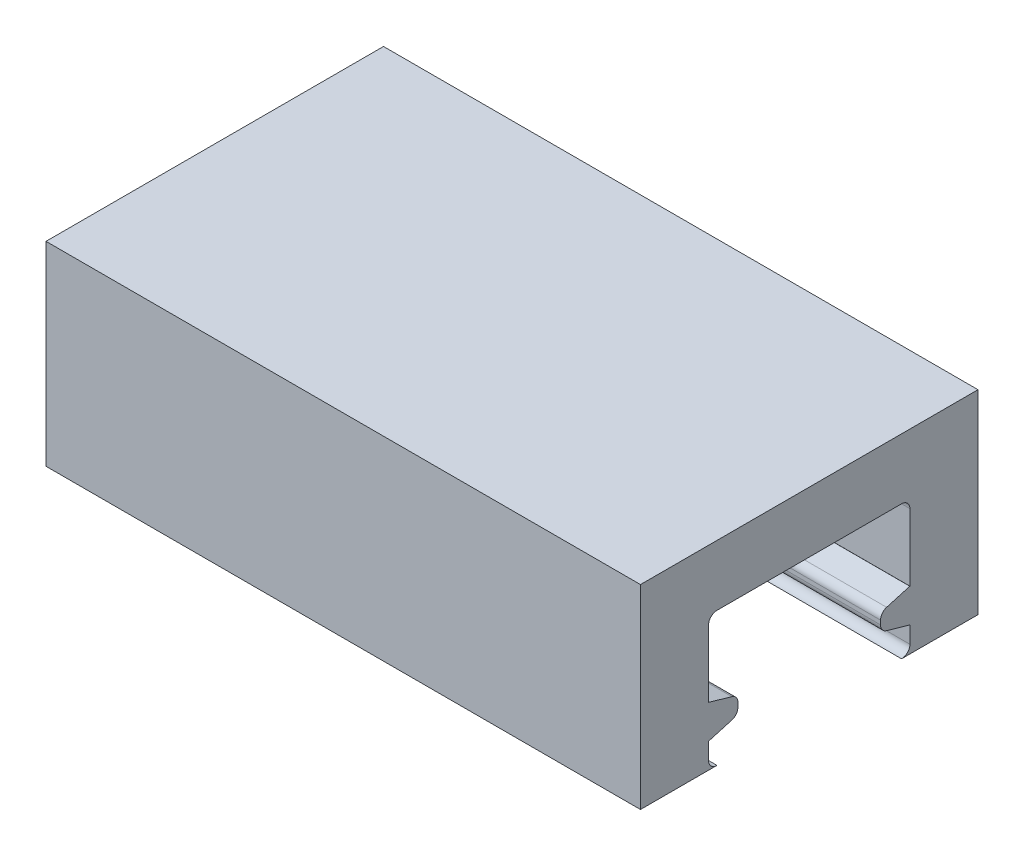
ISO-10303-21;
HEADER;
FILE_DESCRIPTION(('STEP AP214'),'2;1');
FILE_NAME('part.step','',(''),(''),'','','');
FILE_SCHEMA(('AUTOMOTIVE_DESIGN { 1 0 10303 214 1 1 1 1 }'));
ENDSEC;
DATA;
#1=APPLICATION_CONTEXT('core data for automotive mechanical design processes');
#2=APPLICATION_PROTOCOL_DEFINITION('international standard','automotive_design',2000,#1);
#3=PRODUCT_CONTEXT('',#1,'mechanical');
#4=PRODUCT('Part','Part','',(#3));
#5=PRODUCT_RELATED_PRODUCT_CATEGORY('part','',(#4));
#6=PRODUCT_DEFINITION_FORMATION('','',#4);
#7=PRODUCT_DEFINITION_CONTEXT('part definition',#1,'design');
#8=PRODUCT_DEFINITION('design','',#6,#7);
#9=PRODUCT_DEFINITION_SHAPE('','',#8);
#10=(LENGTH_UNIT() NAMED_UNIT(*) SI_UNIT(.MILLI.,.METRE.));
#11=(NAMED_UNIT(*) PLANE_ANGLE_UNIT() SI_UNIT($,.RADIAN.));
#12=(NAMED_UNIT(*) SI_UNIT($,.STERADIAN.) SOLID_ANGLE_UNIT());
#13=UNCERTAINTY_MEASURE_WITH_UNIT(LENGTH_MEASURE(1.E-05),#10,'distance_accuracy_value','');
#14=(GEOMETRIC_REPRESENTATION_CONTEXT(3) GLOBAL_UNCERTAINTY_ASSIGNED_CONTEXT((#13)) GLOBAL_UNIT_ASSIGNED_CONTEXT((#10,
#11,#12)) REPRESENTATION_CONTEXT('',''));
#15=CARTESIAN_POINT('',(0.,0.,0.));
#16=DIRECTION('',(0.,0.,1.));
#17=DIRECTION('',(1.,0.,0.));
#18=AXIS2_PLACEMENT_3D('',#15,#16,#17);
#19=CARTESIAN_POINT('',(0.,0.,0.));
#20=DIRECTION('',(0.,-1.,0.));
#21=DIRECTION('',(0.,0.,-1.));
#22=AXIS2_PLACEMENT_3D('',#19,#20,#21);
#23=PLANE('',#22);
#24=DIRECTION('',(-1.,0.,0.));
#25=VECTOR('',#24,1.);
#26=CARTESIAN_POINT('',(252.165484441284,-1.28508315100362E-11,-34.031249999971));
#27=LINE('',#26,#25);
#28=CARTESIAN_POINT('',(0.,-1.28508315100362E-11,-34.031249999971));
#29=VERTEX_POINT('',#28);
#30=CARTESIAN_POINT('',(77.5,-1.28508315100362E-11,-34.031249999971));
#31=VERTEX_POINT('',#30);
#32=EDGE_CURVE('E254',#29,#31,#27,.F.);
#33=ORIENTED_EDGE('',*,*,#32,.F.);
#34=DIRECTION('',(0.,0.,1.));
#35=VECTOR('',#34,1.);
#36=CARTESIAN_POINT('',(0.,0.,0.));
#37=LINE('',#36,#35);
#38=CARTESIAN_POINT('',(0.,0.,-44.));
#39=VERTEX_POINT('',#38);
#40=EDGE_CURVE('E417',#39,#29,#37,.T.);
#41=ORIENTED_EDGE('',*,*,#40,.F.);
#42=DIRECTION('',(-1.,0.,0.));
#43=VECTOR('',#42,1.);
#44=CARTESIAN_POINT('',(0.,0.,-44.));
#45=LINE('',#44,#43);
#46=CARTESIAN_POINT('',(77.5,0.,-44.));
#47=VERTEX_POINT('',#46);
#48=EDGE_CURVE('E85',#47,#39,#45,.T.);
#49=ORIENTED_EDGE('',*,*,#48,.F.);
#50=DIRECTION('',(0.,0.,-1.));
#51=VECTOR('',#50,1.);
#52=CARTESIAN_POINT('',(77.5,0.,0.));
#53=LINE('',#52,#51);
#54=EDGE_CURVE('E262',#31,#47,#53,.T.);
#55=ORIENTED_EDGE('',*,*,#54,.F.);
#56=EDGE_LOOP('',(#33,#41,#49,#55));
#57=FACE_BOUND('',#56,.T.);
#58=ADVANCED_FACE('F40',(#57),#23,.T.);
#59=CARTESIAN_POINT('',(0.,25.4,0.));
#60=DIRECTION('',(1.,0.,0.));
#61=DIRECTION('',(0.,0.,-1.));
#62=AXIS2_PLACEMENT_3D('',#59,#60,#61);
#63=PLANE('',#62);
#64=ORIENTED_EDGE('',*,*,#40,.T.);
#65=CARTESIAN_POINT('',(0.,1.09374999998715,-34.031249999971));
#66=DIRECTION('',(1.,0.,0.));
#67=DIRECTION('',(0.,0.,-1.));
#68=AXIS2_PLACEMENT_3D('',#65,#66,#67);
#69=CIRCLE('',#68,1.09375);
#70=CARTESIAN_POINT('',(0.,1.09374999998715,-35.124999999971));
#71=VERTEX_POINT('',#70);
#72=EDGE_CURVE('E368',#29,#71,#69,.T.);
#73=ORIENTED_EDGE('',*,*,#72,.T.);
#74=DIRECTION('',(0.,-1.,0.));
#75=VECTOR('',#74,1.);
#76=CARTESIAN_POINT('',(0.,25.4000000000001,-35.1249999999709));
#77=LINE('',#76,#75);
#78=CARTESIAN_POINT('',(0.,3.28124999998716,-35.1249999999709));
#79=VERTEX_POINT('',#78);
#80=EDGE_CURVE('E397',#79,#71,#77,.T.);
#81=ORIENTED_EDGE('',*,*,#80,.F.);
#82=DIRECTION('',(0.,0.,-1.));
#83=VECTOR('',#82,1.);
#84=CARTESIAN_POINT('',(0.,3.28124999998703,0.));
#85=LINE('',#84,#83);
#86=CARTESIAN_POINT('',(0.,3.28124999998716,-35.1112345479222));
#87=VERTEX_POINT('',#86);
#88=EDGE_CURVE('E395',#87,#79,#85,.T.);
#89=ORIENTED_EDGE('',*,*,#88,.F.);
#90=DIRECTION('',(0.,0.275637355816985,0.961261695938323));
#91=VECTOR('',#90,1.);
#92=CARTESIAN_POINT('',(0.,14.2648028755348,3.19296639495498));
#93=LINE('',#92,#91);
#94=CARTESIAN_POINT('',(0.,4.14781976235458,-32.0891466420461));
#95=VERTEX_POINT('',#94);
#96=EDGE_CURVE('E331',#95,#87,#93,.F.);
#97=ORIENTED_EDGE('',*,*,#96,.F.);
#98=CARTESIAN_POINT('',(0.,5.19919974228712,-32.3906249999709));
#99=DIRECTION('',(1.,0.,0.));
#100=DIRECTION('',(0.,0.,-1.));
#101=AXIS2_PLACEMENT_3D('',#98,#99,#100);
#102=CIRCLE('',#101,1.09375);
#103=CARTESIAN_POINT('',(0.,5.19919974228712,-31.2968749999709));
#104=VERTEX_POINT('',#103);
#105=EDGE_CURVE('E375',#104,#95,#102,.T.);
#106=ORIENTED_EDGE('',*,*,#105,.F.);
#107=DIRECTION('',(0.,-1.,0.));
#108=VECTOR('',#107,1.);
#109=CARTESIAN_POINT('',(0.,25.4000000000001,-31.2968749999708));
#110=LINE('',#109,#108);
#111=CARTESIAN_POINT('',(0.,5.7383002576872,-31.2968749999709));
#112=VERTEX_POINT('',#111);
#113=EDGE_CURVE('E350',#112,#104,#110,.T.);
#114=ORIENTED_EDGE('',*,*,#113,.F.);
#115=CARTESIAN_POINT('',(0.,5.73830025768721,-32.3906249999709));
#116=DIRECTION('',(1.,0.,0.));
#117=DIRECTION('',(0.,0.,-1.));
#118=AXIS2_PLACEMENT_3D('',#115,#116,#117);
#119=CIRCLE('',#118,1.09375);
#120=CARTESIAN_POINT('',(0.,6.78968023761974,-32.0891466420461));
#121=VERTEX_POINT('',#120);
#122=EDGE_CURVE('E377',#121,#112,#119,.T.);
#123=ORIENTED_EDGE('',*,*,#122,.F.);
#124=DIRECTION('',(0.,0.275637355816993,-0.961261695938321));
#125=VECTOR('',#124,1.);
#126=CARTESIAN_POINT('',(0.,-0.298711492076706,-7.36898694029967));
#127=LINE('',#126,#125);
#128=CARTESIAN_POINT('',(0.,7.65624999998716,-35.1112345479221));
#129=VERTEX_POINT('',#128);
#130=EDGE_CURVE('E389',#129,#121,#127,.F.);
#131=ORIENTED_EDGE('',*,*,#130,.F.);
#132=DIRECTION('',(0.,0.,1.));
#133=VECTOR('',#132,1.);
#134=CARTESIAN_POINT('',(0.,7.65624999998703,0.));
#135=LINE('',#134,#133);
#136=CARTESIAN_POINT('',(0.,7.65624999998716,-35.1249999999709));
#137=VERTEX_POINT('',#136);
#138=EDGE_CURVE('E392',#137,#129,#135,.T.);
#139=ORIENTED_EDGE('',*,*,#138,.F.);
#140=DIRECTION('',(0.,-1.,0.));
#141=VECTOR('',#140,1.);
#142=CARTESIAN_POINT('',(0.,25.4000000000001,-35.1249999999709));
#143=LINE('',#142,#141);
#144=CARTESIAN_POINT('',(0.,16.4062499999872,-35.1249999999709));
#145=VERTEX_POINT('',#144);
#146=EDGE_CURVE('E411',#145,#137,#143,.T.);
#147=ORIENTED_EDGE('',*,*,#146,.F.);
#148=CARTESIAN_POINT('',(0.,16.4062499999872,-34.0312499999709));
#149=DIRECTION('',(1.,0.,0.));
#150=DIRECTION('',(0.,0.,-1.));
#151=AXIS2_PLACEMENT_3D('',#148,#149,#150);
#152=CIRCLE('',#151,1.09375);
#153=CARTESIAN_POINT('',(0.,17.4999999999872,-34.0312499999709));
#154=VERTEX_POINT('',#153);
#155=EDGE_CURVE('E379',#145,#154,#152,.T.);
#156=ORIENTED_EDGE('',*,*,#155,.T.);
#157=DIRECTION('',(0.,0.,-1.));
#158=VECTOR('',#157,1.);
#159=CARTESIAN_POINT('',(0.,17.4999999999871,0.));
#160=LINE('',#159,#158);
#161=CARTESIAN_POINT('',(0.,17.4999999999871,-9.96874999997089));
#162=VERTEX_POINT('',#161);
#163=EDGE_CURVE('E409',#162,#154,#160,.T.);
#164=ORIENTED_EDGE('',*,*,#163,.F.);
#165=CARTESIAN_POINT('',(0.,16.4062499999871,-9.9687499999709));
#166=DIRECTION('',(1.,0.,0.));
#167=DIRECTION('',(0.,0.,-1.));
#168=AXIS2_PLACEMENT_3D('',#165,#166,#167);
#169=CIRCLE('',#168,1.09375);
#170=CARTESIAN_POINT('',(0.,16.4062499999871,-8.8749999999709));
#171=VERTEX_POINT('',#170);
#172=EDGE_CURVE('E382',#162,#171,#169,.T.);
#173=ORIENTED_EDGE('',*,*,#172,.T.);
#174=DIRECTION('',(0.,1.,0.));
#175=VECTOR('',#174,1.);
#176=CARTESIAN_POINT('',(0.,25.4,-8.87499999997086));
#177=LINE('',#176,#175);
#178=CARTESIAN_POINT('',(0.,7.65624999998706,-8.87499999997093));
#179=VERTEX_POINT('',#178);
#180=EDGE_CURVE('E407',#179,#171,#177,.T.);
#181=ORIENTED_EDGE('',*,*,#180,.F.);
#182=DIRECTION('',(0.,0.,1.));
#183=VECTOR('',#182,1.);
#184=CARTESIAN_POINT('',(0.,7.65624999998703,0.));
#185=LINE('',#184,#183);
#186=CARTESIAN_POINT('',(0.,7.65624999998706,-8.88876545201967));
#187=VERTEX_POINT('',#186);
#188=EDGE_CURVE('E405',#187,#179,#185,.T.);
#189=ORIENTED_EDGE('',*,*,#188,.F.);
#190=DIRECTION('',(0.,-0.275637355816985,-0.961261695938323));
#191=VECTOR('',#190,1.);
#192=CARTESIAN_POINT('',(0.,11.3595123210379,4.02604505574556));
#193=LINE('',#192,#191);
#194=CARTESIAN_POINT('',(0.,6.78968023761964,-11.9108533578958));
#195=VERTEX_POINT('',#194);
#196=EDGE_CURVE('E385',#195,#187,#193,.F.);
#197=ORIENTED_EDGE('',*,*,#196,.F.);
#198=CARTESIAN_POINT('',(0.,5.7383002576871,-11.6093749999709));
#199=DIRECTION('',(1.,0.,0.));
#200=DIRECTION('',(0.,0.,-1.));
#201=AXIS2_PLACEMENT_3D('',#198,#199,#200);
#202=CIRCLE('',#201,1.09375);
#203=CARTESIAN_POINT('',(0.,5.7383002576871,-12.7031249999709));
#204=VERTEX_POINT('',#203);
#205=EDGE_CURVE('E371',#204,#195,#202,.T.);
#206=ORIENTED_EDGE('',*,*,#205,.F.);
#207=DIRECTION('',(0.,1.,0.));
#208=VECTOR('',#207,1.);
#209=CARTESIAN_POINT('',(0.,25.4,-12.7031249999709));
#210=LINE('',#209,#208);
#211=CARTESIAN_POINT('',(0.,5.19919974228702,-12.7031249999709));
#212=VERTEX_POINT('',#211);
#213=EDGE_CURVE('E403',#212,#204,#210,.T.);
#214=ORIENTED_EDGE('',*,*,#213,.F.);
#215=CARTESIAN_POINT('',(0.,5.19919974228701,-11.6093749999709));
#216=DIRECTION('',(1.,0.,0.));
#217=DIRECTION('',(0.,0.,-1.));
#218=AXIS2_PLACEMENT_3D('',#215,#216,#217);
#219=CIRCLE('',#218,1.09375);
#220=CARTESIAN_POINT('',(0.,4.14781976235447,-11.9108533578958));
#221=VERTEX_POINT('',#220);
#222=EDGE_CURVE('E373',#221,#212,#219,.T.);
#223=ORIENTED_EDGE('',*,*,#222,.F.);
#224=DIRECTION('',(0.,-0.275637355816993,0.961261695938321));
#225=VECTOR('',#224,1.);
#226=CARTESIAN_POINT('',(0.,2.60657906242011,-6.53590827950908));
#227=LINE('',#226,#225);
#228=CARTESIAN_POINT('',(0.,3.28124999998706,-8.8887654520198));
#229=VERTEX_POINT('',#228);
#230=EDGE_CURVE('E387',#229,#221,#227,.F.);
#231=ORIENTED_EDGE('',*,*,#230,.F.);
#232=DIRECTION('',(0.,0.,-1.));
#233=VECTOR('',#232,1.);
#234=CARTESIAN_POINT('',(0.,3.28124999998703,0.));
#235=LINE('',#234,#233);
#236=CARTESIAN_POINT('',(0.,3.28124999998706,-8.87499999997094));
#237=VERTEX_POINT('',#236);
#238=EDGE_CURVE('E401',#237,#229,#235,.T.);
#239=ORIENTED_EDGE('',*,*,#238,.F.);
#240=DIRECTION('',(0.,1.,0.));
#241=VECTOR('',#240,1.);
#242=CARTESIAN_POINT('',(0.,25.4,-8.87499999997086));
#243=LINE('',#242,#241);
#244=CARTESIAN_POINT('',(0.,1.09374999998706,-8.87499999997095));
#245=VERTEX_POINT('',#244);
#246=EDGE_CURVE('E399',#245,#237,#243,.T.);
#247=ORIENTED_EDGE('',*,*,#246,.F.);
#248=CARTESIAN_POINT('',(0.,1.09374999998707,-9.96874999997095));
#249=DIRECTION('',(1.,0.,0.));
#250=DIRECTION('',(0.,0.,-1.));
#251=AXIS2_PLACEMENT_3D('',#248,#249,#250);
#252=CIRCLE('',#251,1.09375);
#253=CARTESIAN_POINT('',(0.,-1.29340982368831E-11,-9.96874999997095));
#254=VERTEX_POINT('',#253);
#255=EDGE_CURVE('E244',#245,#254,#252,.T.);
#256=ORIENTED_EDGE('',*,*,#255,.T.);
#257=CARTESIAN_POINT('',(0.,0.,0.));
#258=VERTEX_POINT('',#257);
#259=EDGE_CURVE('E253',#254,#258,#37,.T.);
#260=ORIENTED_EDGE('',*,*,#259,.T.);
#261=DIRECTION('',(0.,-1.,0.));
#262=VECTOR('',#261,1.);
#263=CARTESIAN_POINT('',(0.,25.4,0.));
#264=LINE('',#263,#262);
#265=CARTESIAN_POINT('',(0.,25.4,0.));
#266=VERTEX_POINT('',#265);
#267=EDGE_CURVE('E255',#266,#258,#264,.T.);
#268=ORIENTED_EDGE('',*,*,#267,.F.);
#269=DIRECTION('',(0.,0.,1.));
#270=VECTOR('',#269,1.);
#271=CARTESIAN_POINT('',(0.,25.4,0.));
#272=LINE('',#271,#270);
#273=CARTESIAN_POINT('',(0.,25.4,-44.));
#274=VERTEX_POINT('',#273);
#275=EDGE_CURVE('E264',#274,#266,#272,.T.);
#276=ORIENTED_EDGE('',*,*,#275,.F.);
#277=DIRECTION('',(0.,-1.,0.));
#278=VECTOR('',#277,1.);
#279=CARTESIAN_POINT('',(0.,25.4,-44.));
#280=LINE('',#279,#278);
#281=EDGE_CURVE('E270',#274,#39,#280,.T.);
#282=ORIENTED_EDGE('',*,*,#281,.T.);
#283=EDGE_LOOP('',(#64,#73,#81,#89,#97,#106,#114,#123,#131,#139,#147,#156,#164,#173,#181,#189,
#197,#206,#214,#223,#231,#239,#247,#256,#260,#268,#276,#282));
#284=FACE_BOUND('',#283,.T.);
#285=ADVANCED_FACE('F42',(#284),#63,.F.);
#286=CARTESIAN_POINT('',(0.,25.4,0.));
#287=DIRECTION('',(0.,0.,-1.));
#288=DIRECTION('',(-1.,0.,0.));
#289=AXIS2_PLACEMENT_3D('',#286,#287,#288);
#290=PLANE('',#289);
#291=DIRECTION('',(1.,0.,0.));
#292=VECTOR('',#291,1.);
#293=CARTESIAN_POINT('',(0.,0.,0.));
#294=LINE('',#293,#292);
#295=CARTESIAN_POINT('',(77.5,0.,0.));
#296=VERTEX_POINT('',#295);
#297=EDGE_CURVE('E266',#258,#296,#294,.T.);
#298=ORIENTED_EDGE('',*,*,#297,.T.);
#299=DIRECTION('',(0.,-1.,0.));
#300=VECTOR('',#299,1.);
#301=CARTESIAN_POINT('',(77.5,25.4,0.));
#302=LINE('',#301,#300);
#303=CARTESIAN_POINT('',(77.5,25.4,0.));
#304=VERTEX_POINT('',#303);
#305=EDGE_CURVE('E261',#304,#296,#302,.T.);
#306=ORIENTED_EDGE('',*,*,#305,.F.);
#307=DIRECTION('',(1.,0.,0.));
#308=VECTOR('',#307,1.);
#309=CARTESIAN_POINT('',(0.,25.4,0.));
#310=LINE('',#309,#308);
#311=EDGE_CURVE('E93',#266,#304,#310,.T.);
#312=ORIENTED_EDGE('',*,*,#311,.F.);
#313=ORIENTED_EDGE('',*,*,#267,.T.);
#314=EDGE_LOOP('',(#298,#306,#312,#313));
#315=FACE_BOUND('',#314,.T.);
#316=ADVANCED_FACE('F424',(#315),#290,.F.);
#317=CARTESIAN_POINT('',(77.5,25.4,0.));
#318=DIRECTION('',(-1.,0.,0.));
#319=DIRECTION('',(0.,0.,1.));
#320=AXIS2_PLACEMENT_3D('',#317,#318,#319);
#321=PLANE('',#320);
#322=DIRECTION('',(0.,1.,0.));
#323=VECTOR('',#322,1.);
#324=CARTESIAN_POINT('',(77.5,25.4000000000001,-35.1249999999709));
#325=LINE('',#324,#323);
#326=CARTESIAN_POINT('',(77.5,1.09374999998715,-35.124999999971));
#327=VERTEX_POINT('',#326);
#328=CARTESIAN_POINT('',(77.5,3.28124999998716,-35.1249999999709));
#329=VERTEX_POINT('',#328);
#330=EDGE_CURVE('E12',#327,#329,#325,.T.);
#331=ORIENTED_EDGE('',*,*,#330,.F.);
#332=CARTESIAN_POINT('',(77.5,1.09374999998715,-34.031249999971));
#333=DIRECTION('',(-1.,0.,0.));
#334=DIRECTION('',(0.,0.,1.));
#335=AXIS2_PLACEMENT_3D('',#332,#333,#334);
#336=CIRCLE('',#335,1.09375);
#337=EDGE_CURVE('E365',#327,#31,#336,.T.);
#338=ORIENTED_EDGE('',*,*,#337,.T.);
#339=ORIENTED_EDGE('',*,*,#54,.T.);
#340=DIRECTION('',(0.,-1.,0.));
#341=VECTOR('',#340,1.);
#342=CARTESIAN_POINT('',(77.5,25.4,-44.));
#343=LINE('',#342,#341);
#344=CARTESIAN_POINT('',(77.5,25.4,-44.));
#345=VERTEX_POINT('',#344);
#346=EDGE_CURVE('E272',#345,#47,#343,.T.);
#347=ORIENTED_EDGE('',*,*,#346,.F.);
#348=DIRECTION('',(0.,0.,-1.));
#349=VECTOR('',#348,1.);
#350=CARTESIAN_POINT('',(77.5,25.4,0.));
#351=LINE('',#350,#349);
#352=EDGE_CURVE('E415',#304,#345,#351,.T.);
#353=ORIENTED_EDGE('',*,*,#352,.F.);
#354=ORIENTED_EDGE('',*,*,#305,.T.);
#355=CARTESIAN_POINT('',(77.5,-1.29340982368831E-11,-9.96874999997095));
#356=VERTEX_POINT('',#355);
#357=EDGE_CURVE('E252',#296,#356,#53,.T.);
#358=ORIENTED_EDGE('',*,*,#357,.T.);
#359=CARTESIAN_POINT('',(77.5,1.09374999998707,-9.96874999997095));
#360=DIRECTION('',(-1.,0.,0.));
#361=DIRECTION('',(0.,0.,1.));
#362=AXIS2_PLACEMENT_3D('',#359,#360,#361);
#363=CIRCLE('',#362,1.09375);
#364=CARTESIAN_POINT('',(77.5,1.09374999998706,-8.87499999997095));
#365=VERTEX_POINT('',#364);
#366=EDGE_CURVE('E234',#356,#365,#363,.T.);
#367=ORIENTED_EDGE('',*,*,#366,.T.);
#368=DIRECTION('',(0.,-1.,0.));
#369=VECTOR('',#368,1.);
#370=CARTESIAN_POINT('',(77.5,25.4,-8.87499999997086));
#371=LINE('',#370,#369);
#372=CARTESIAN_POINT('',(77.5,3.28124999998706,-8.87499999997094));
#373=VERTEX_POINT('',#372);
#374=EDGE_CURVE('E300',#373,#365,#371,.T.);
#375=ORIENTED_EDGE('',*,*,#374,.F.);
#376=DIRECTION('',(0.,0.,1.));
#377=VECTOR('',#376,1.);
#378=CARTESIAN_POINT('',(77.5,3.28124999998703,0.));
#379=LINE('',#378,#377);
#380=CARTESIAN_POINT('',(77.5,3.28124999998706,-8.8887654520198));
#381=VERTEX_POINT('',#380);
#382=EDGE_CURVE('E293',#381,#373,#379,.T.);
#383=ORIENTED_EDGE('',*,*,#382,.F.);
#384=DIRECTION('',(0.,0.275637355816993,-0.961261695938321));
#385=VECTOR('',#384,1.);
#386=CARTESIAN_POINT('',(77.5,2.60657906242011,-6.53590827950908));
#387=LINE('',#386,#385);
#388=CARTESIAN_POINT('',(77.5,4.14781976235447,-11.9108533578958));
#389=VERTEX_POINT('',#388);
#390=EDGE_CURVE('E291',#389,#381,#387,.F.);
#391=ORIENTED_EDGE('',*,*,#390,.F.);
#392=CARTESIAN_POINT('',(77.5,5.19919974228701,-11.6093749999709));
#393=DIRECTION('',(-1.,0.,0.));
#394=DIRECTION('',(0.,0.,1.));
#395=AXIS2_PLACEMENT_3D('',#392,#393,#394);
#396=CIRCLE('',#395,1.09375);
#397=CARTESIAN_POINT('',(77.5,5.19919974228702,-12.7031249999709));
#398=VERTEX_POINT('',#397);
#399=EDGE_CURVE('E286',#398,#389,#396,.T.);
#400=ORIENTED_EDGE('',*,*,#399,.F.);
#401=DIRECTION('',(0.,-1.,0.));
#402=VECTOR('',#401,1.);
#403=CARTESIAN_POINT('',(77.5,25.4,-12.7031249999709));
#404=LINE('',#403,#402);
#405=CARTESIAN_POINT('',(77.5,5.7383002576871,-12.7031249999709));
#406=VERTEX_POINT('',#405);
#407=EDGE_CURVE('E280',#406,#398,#404,.T.);
#408=ORIENTED_EDGE('',*,*,#407,.F.);
#409=CARTESIAN_POINT('',(77.5,5.7383002576871,-11.6093749999709));
#410=DIRECTION('',(-1.,0.,0.));
#411=DIRECTION('',(0.,0.,1.));
#412=AXIS2_PLACEMENT_3D('',#409,#410,#411);
#413=CIRCLE('',#412,1.09375);
#414=CARTESIAN_POINT('',(77.5,6.78968023761964,-11.9108533578958));
#415=VERTEX_POINT('',#414);
#416=EDGE_CURVE('E276',#415,#406,#413,.T.);
#417=ORIENTED_EDGE('',*,*,#416,.F.);
#418=DIRECTION('',(0.,0.275637355816985,0.961261695938323));
#419=VECTOR('',#418,1.);
#420=CARTESIAN_POINT('',(77.5,11.3595123210379,4.02604505574556));
#421=LINE('',#420,#419);
#422=CARTESIAN_POINT('',(77.5,7.65624999998706,-8.88876545201967));
#423=VERTEX_POINT('',#422);
#424=EDGE_CURVE('E278',#423,#415,#421,.F.);
#425=ORIENTED_EDGE('',*,*,#424,.F.);
#426=DIRECTION('',(0.,0.,-1.));
#427=VECTOR('',#426,1.);
#428=CARTESIAN_POINT('',(77.5,7.65624999998703,0.));
#429=LINE('',#428,#427);
#430=CARTESIAN_POINT('',(77.5,7.65624999998706,-8.87499999997093));
#431=VERTEX_POINT('',#430);
#432=EDGE_CURVE('E282',#431,#423,#429,.T.);
#433=ORIENTED_EDGE('',*,*,#432,.F.);
#434=DIRECTION('',(0.,-1.,0.));
#435=VECTOR('',#434,1.);
#436=CARTESIAN_POINT('',(77.5,25.4,-8.87499999997086));
#437=LINE('',#436,#435);
#438=CARTESIAN_POINT('',(77.5,16.4062499999871,-8.8749999999709));
#439=VERTEX_POINT('',#438);
#440=EDGE_CURVE('E284',#439,#431,#437,.T.);
#441=ORIENTED_EDGE('',*,*,#440,.F.);
#442=CARTESIAN_POINT('',(77.5,16.4062499999871,-9.9687499999709));
#443=DIRECTION('',(-1.,0.,0.));
#444=DIRECTION('',(0.,0.,1.));
#445=AXIS2_PLACEMENT_3D('',#442,#443,#444);
#446=CIRCLE('',#445,1.09375);
#447=CARTESIAN_POINT('',(77.5,17.4999999999871,-9.96874999997089));
#448=VERTEX_POINT('',#447);
#449=EDGE_CURVE('E288',#439,#448,#446,.T.);
#450=ORIENTED_EDGE('',*,*,#449,.T.);
#451=DIRECTION('',(0.,0.,1.));
#452=VECTOR('',#451,1.);
#453=CARTESIAN_POINT('',(77.5,17.4999999999871,0.));
#454=LINE('',#453,#452);
#455=CARTESIAN_POINT('',(77.5,17.4999999999872,-34.0312499999709));
#456=VERTEX_POINT('',#455);
#457=EDGE_CURVE('E295',#456,#448,#454,.T.);
#458=ORIENTED_EDGE('',*,*,#457,.F.);
#459=CARTESIAN_POINT('',(77.5,16.4062499999872,-34.0312499999709));
#460=DIRECTION('',(-1.,0.,0.));
#461=DIRECTION('',(0.,0.,1.));
#462=AXIS2_PLACEMENT_3D('',#459,#460,#461);
#463=CIRCLE('',#462,1.09375);
#464=CARTESIAN_POINT('',(77.5,16.4062499999872,-35.1249999999709));
#465=VERTEX_POINT('',#464);
#466=EDGE_CURVE('E297',#456,#465,#463,.T.);
#467=ORIENTED_EDGE('',*,*,#466,.T.);
#468=DIRECTION('',(0.,1.,0.));
#469=VECTOR('',#468,1.);
#470=CARTESIAN_POINT('',(77.5,25.4000000000001,-35.1249999999709));
#471=LINE('',#470,#469);
#472=CARTESIAN_POINT('',(77.5,7.65624999998716,-35.1249999999709));
#473=VERTEX_POINT('',#472);
#474=EDGE_CURVE('E302',#473,#465,#471,.T.);
#475=ORIENTED_EDGE('',*,*,#474,.F.);
#476=DIRECTION('',(0.,0.,-1.));
#477=VECTOR('',#476,1.);
#478=CARTESIAN_POINT('',(77.5,7.65624999998703,0.));
#479=LINE('',#478,#477);
#480=CARTESIAN_POINT('',(77.5,7.65624999998716,-35.1112345479221));
#481=VERTEX_POINT('',#480);
#482=EDGE_CURVE('E304',#481,#473,#479,.T.);
#483=ORIENTED_EDGE('',*,*,#482,.F.);
#484=DIRECTION('',(0.,-0.275637355816993,0.961261695938321));
#485=VECTOR('',#484,1.);
#486=CARTESIAN_POINT('',(77.5,-0.298711492076706,-7.36898694029967));
#487=LINE('',#486,#485);
#488=CARTESIAN_POINT('',(77.5,6.78968023761974,-32.0891466420461));
#489=VERTEX_POINT('',#488);
#490=EDGE_CURVE('E306',#489,#481,#487,.F.);
#491=ORIENTED_EDGE('',*,*,#490,.F.);
#492=CARTESIAN_POINT('',(77.5,5.73830025768721,-32.3906249999709));
#493=DIRECTION('',(-1.,0.,0.));
#494=DIRECTION('',(0.,0.,1.));
#495=AXIS2_PLACEMENT_3D('',#492,#493,#494);
#496=CIRCLE('',#495,1.09375);
#497=CARTESIAN_POINT('',(77.5,5.7383002576872,-31.2968749999709));
#498=VERTEX_POINT('',#497);
#499=EDGE_CURVE('E308',#498,#489,#496,.T.);
#500=ORIENTED_EDGE('',*,*,#499,.F.);
#501=DIRECTION('',(0.,1.,0.));
#502=VECTOR('',#501,1.);
#503=CARTESIAN_POINT('',(77.5,25.4000000000001,-31.2968749999708));
#504=LINE('',#503,#502);
#505=CARTESIAN_POINT('',(77.5,5.19919974228712,-31.2968749999709));
#506=VERTEX_POINT('',#505);
#507=EDGE_CURVE('E310',#506,#498,#504,.T.);
#508=ORIENTED_EDGE('',*,*,#507,.F.);
#509=CARTESIAN_POINT('',(77.5,5.19919974228712,-32.3906249999709));
#510=DIRECTION('',(-1.,0.,0.));
#511=DIRECTION('',(0.,0.,1.));
#512=AXIS2_PLACEMENT_3D('',#509,#510,#511);
#513=CIRCLE('',#512,1.09375);
#514=CARTESIAN_POINT('',(77.5,4.14781976235458,-32.0891466420461));
#515=VERTEX_POINT('',#514);
#516=EDGE_CURVE('E312',#515,#506,#513,.T.);
#517=ORIENTED_EDGE('',*,*,#516,.F.);
#518=DIRECTION('',(0.,-0.275637355816985,-0.961261695938323));
#519=VECTOR('',#518,1.);
#520=CARTESIAN_POINT('',(77.5,14.2648028755348,3.19296639495498));
#521=LINE('',#520,#519);
#522=CARTESIAN_POINT('',(77.5,3.28124999998716,-35.1112345479222));
#523=VERTEX_POINT('',#522);
#524=EDGE_CURVE('E314',#523,#515,#521,.F.);
#525=ORIENTED_EDGE('',*,*,#524,.F.);
#526=DIRECTION('',(0.,0.,1.));
#527=VECTOR('',#526,1.);
#528=CARTESIAN_POINT('',(77.5,3.28124999998703,0.));
#529=LINE('',#528,#527);
#530=EDGE_CURVE('E48',#329,#523,#529,.T.);
#531=ORIENTED_EDGE('',*,*,#530,.F.);
#532=EDGE_LOOP('',(#331,#338,#339,#347,#353,#354,#358,#367,#375,#383,#391,#400,#408,#417,#425,
#433,#441,#450,#458,#467,#475,#483,#491,#500,#508,#517,#525,#531));
#533=FACE_BOUND('',#532,.T.);
#534=ADVANCED_FACE('F259',(#533),#321,.F.);
#535=CARTESIAN_POINT('',(0.,25.4,-44.));
#536=DIRECTION('',(0.,0.,1.));
#537=DIRECTION('',(1.,0.,0.));
#538=AXIS2_PLACEMENT_3D('',#535,#536,#537);
#539=PLANE('',#538);
#540=ORIENTED_EDGE('',*,*,#48,.T.);
#541=ORIENTED_EDGE('',*,*,#281,.F.);
#542=DIRECTION('',(-1.,0.,0.));
#543=VECTOR('',#542,1.);
#544=CARTESIAN_POINT('',(0.,25.4,-44.));
#545=LINE('',#544,#543);
#546=EDGE_CURVE('E64',#345,#274,#545,.T.);
#547=ORIENTED_EDGE('',*,*,#546,.F.);
#548=ORIENTED_EDGE('',*,*,#346,.T.);
#549=EDGE_LOOP('',(#540,#541,#547,#548));
#550=FACE_BOUND('',#549,.T.);
#551=ADVANCED_FACE('F430',(#550),#539,.F.);
#552=CARTESIAN_POINT('',(0.,25.4,0.));
#553=DIRECTION('',(0.,-1.,0.));
#554=DIRECTION('',(0.,0.,-1.));
#555=AXIS2_PLACEMENT_3D('',#552,#553,#554);
#556=PLANE('',#555);
#557=ORIENTED_EDGE('',*,*,#275,.T.);
#558=ORIENTED_EDGE('',*,*,#311,.T.);
#559=ORIENTED_EDGE('',*,*,#352,.T.);
#560=ORIENTED_EDGE('',*,*,#546,.T.);
#561=EDGE_LOOP('',(#557,#558,#559,#560));
#562=FACE_BOUND('',#561,.T.);
#563=ADVANCED_FACE('F448',(#562),#556,.F.);
#564=DIRECTION('',(-1.,0.,0.));
#565=VECTOR('',#564,1.);
#566=CARTESIAN_POINT('',(252.165484441284,-1.29340982368831E-11,-9.96874999997095));
#567=LINE('',#566,#565);
#568=EDGE_CURVE('E237',#356,#254,#567,.T.);
#569=ORIENTED_EDGE('',*,*,#568,.F.);
#570=ORIENTED_EDGE('',*,*,#357,.F.);
#571=ORIENTED_EDGE('',*,*,#297,.F.);
#572=ORIENTED_EDGE('',*,*,#259,.F.);
#573=EDGE_LOOP('',(#569,#570,#571,#572));
#574=FACE_BOUND('',#573,.T.);
#575=ADVANCED_FACE('F250',(#574),#23,.T.);
#576=CARTESIAN_POINT('',(252.165484441284,7.65624999998716,-35.1249999999709));
#577=DIRECTION('',(0.,0.,1.));
#578=DIRECTION('',(0.,-1.,0.));
#579=AXIS2_PLACEMENT_3D('',#576,#577,#578);
#580=PLANE('',#579);
#581=ORIENTED_EDGE('',*,*,#146,.T.);
#582=DIRECTION('',(-1.,0.,0.));
#583=VECTOR('',#582,1.);
#584=CARTESIAN_POINT('',(252.165484441284,7.65624999998716,-35.1249999999709));
#585=LINE('',#584,#583);
#586=EDGE_CURVE('E557',#473,#137,#585,.T.);
#587=ORIENTED_EDGE('',*,*,#586,.F.);
#588=ORIENTED_EDGE('',*,*,#474,.T.);
#589=DIRECTION('',(-1.,0.,0.));
#590=VECTOR('',#589,1.);
#591=CARTESIAN_POINT('',(252.165484441284,16.4062499999872,-35.1249999999709));
#592=LINE('',#591,#590);
#593=EDGE_CURVE('E572',#145,#465,#592,.F.);
#594=ORIENTED_EDGE('',*,*,#593,.F.);
#595=EDGE_LOOP('',(#581,#587,#588,#594));
#596=FACE_BOUND('',#595,.T.);
#597=ADVANCED_FACE('F447',(#596),#580,.T.);
#598=CARTESIAN_POINT('',(252.165484441284,17.4999999999871,-8.87499999997089));
#599=DIRECTION('',(0.,-1.,0.));
#600=DIRECTION('',(1.,0.,0.));
#601=AXIS2_PLACEMENT_3D('',#598,#599,#600);
#602=PLANE('',#601);
#603=CARTESIAN_POINT('',(39.6848594412841,17.4999999999871,-21.9999999999709));
#604=DIRECTION('',(0.,-1.,0.));
#605=DIRECTION('',(1.,0.,0.));
#606=AXIS2_PLACEMENT_3D('',#603,#604,#605);
#607=CIRCLE('',#606,3.82812499999996);
#608=CARTESIAN_POINT('',(43.512984441284,17.4999999999871,-21.9999999999709));
#609=VERTEX_POINT('',#608);
#610=EDGE_CURVE('E554',#609,#609,#607,.T.);
#611=ORIENTED_EDGE('',*,*,#610,.F.);
#612=EDGE_LOOP('',(#611));
#613=FACE_BOUND('',#612,.T.);
#614=ORIENTED_EDGE('',*,*,#163,.T.);
#615=DIRECTION('',(-1.,0.,0.));
#616=VECTOR('',#615,1.);
#617=CARTESIAN_POINT('',(252.165484441284,17.4999999999872,-34.0312499999709));
#618=LINE('',#617,#616);
#619=EDGE_CURVE('E581',#456,#154,#618,.T.);
#620=ORIENTED_EDGE('',*,*,#619,.F.);
#621=ORIENTED_EDGE('',*,*,#457,.T.);
#622=DIRECTION('',(-1.,0.,0.));
#623=VECTOR('',#622,1.);
#624=CARTESIAN_POINT('',(252.165484441284,17.4999999999871,-9.96874999997089));
#625=LINE('',#624,#623);
#626=EDGE_CURVE('E578',#162,#448,#625,.F.);
#627=ORIENTED_EDGE('',*,*,#626,.F.);
#628=EDGE_LOOP('',(#614,#620,#621,#627));
#629=FACE_BOUND('',#628,.T.);
#630=ADVANCED_FACE('F452',(#613,#629),#602,.T.);
#631=CARTESIAN_POINT('',(252.165484441284,7.65624999998706,-8.87499999997093));
#632=DIRECTION('',(0.,0.,-1.));
#633=DIRECTION('',(0.,1.,0.));
#634=AXIS2_PLACEMENT_3D('',#631,#632,#633);
#635=PLANE('',#634);
#636=ORIENTED_EDGE('',*,*,#180,.T.);
#637=DIRECTION('',(-1.,0.,0.));
#638=VECTOR('',#637,1.);
#639=CARTESIAN_POINT('',(252.165484441284,16.4062499999871,-8.8749999999709));
#640=LINE('',#639,#638);
#641=EDGE_CURVE('E585',#439,#171,#640,.T.);
#642=ORIENTED_EDGE('',*,*,#641,.F.);
#643=ORIENTED_EDGE('',*,*,#440,.T.);
#644=DIRECTION('',(-1.,0.,0.));
#645=VECTOR('',#644,1.);
#646=CARTESIAN_POINT('',(252.165484441284,7.65624999998706,-8.87499999997093));
#647=LINE('',#646,#645);
#648=EDGE_CURVE('E333',#431,#179,#647,.T.);
#649=ORIENTED_EDGE('',*,*,#648,.T.);
#650=EDGE_LOOP('',(#636,#642,#643,#649));
#651=FACE_BOUND('',#650,.T.);
#652=ADVANCED_FACE('F503',(#651),#635,.T.);
#653=CARTESIAN_POINT('',(252.165484441284,7.65624999998706,-8.87499999997093));
#654=DIRECTION('',(0.,1.,0.));
#655=DIRECTION('',(-1.,0.,0.));
#656=AXIS2_PLACEMENT_3D('',#653,#654,#655);
#657=PLANE('',#656);
#658=ORIENTED_EDGE('',*,*,#188,.T.);
#659=ORIENTED_EDGE('',*,*,#648,.F.);
#660=ORIENTED_EDGE('',*,*,#432,.T.);
#661=DIRECTION('',(1.,0.,0.));
#662=VECTOR('',#661,1.);
#663=CARTESIAN_POINT('',(252.165484441284,7.65624999998706,-8.88876545201967));
#664=LINE('',#663,#662);
#665=EDGE_CURVE('E569',#187,#423,#664,.T.);
#666=ORIENTED_EDGE('',*,*,#665,.F.);
#667=EDGE_LOOP('',(#658,#659,#660,#666));
#668=FACE_BOUND('',#667,.T.);
#669=ADVANCED_FACE('F507',(#668),#657,.T.);
#670=CARTESIAN_POINT('',(252.165484441284,3.28124999998708,-12.7031249999709));
#671=DIRECTION('',(0.,0.,-1.));
#672=DIRECTION('',(0.,1.,0.));
#673=AXIS2_PLACEMENT_3D('',#670,#671,#672);
#674=PLANE('',#673);
#675=ORIENTED_EDGE('',*,*,#213,.T.);
#676=DIRECTION('',(1.,0.,0.));
#677=VECTOR('',#676,1.);
#678=CARTESIAN_POINT('',(-426.252640558716,5.7383002576871,-12.7031249999709));
#679=LINE('',#678,#677);
#680=EDGE_CURVE('E354',#406,#204,#679,.F.);
#681=ORIENTED_EDGE('',*,*,#680,.F.);
#682=ORIENTED_EDGE('',*,*,#407,.T.);
#683=DIRECTION('',(-1.,0.,0.));
#684=VECTOR('',#683,1.);
#685=CARTESIAN_POINT('',(252.165484441284,5.19919974228702,-12.7031249999709));
#686=LINE('',#685,#684);
#687=EDGE_CURVE('E245',#212,#398,#686,.F.);
#688=ORIENTED_EDGE('',*,*,#687,.F.);
#689=EDGE_LOOP('',(#675,#681,#682,#688));
#690=FACE_BOUND('',#689,.T.);
#691=ADVANCED_FACE('F511',(#690),#674,.T.);
#692=CARTESIAN_POINT('',(252.165484441284,3.28124999998706,-8.87499999997094));
#693=DIRECTION('',(0.,-1.,0.));
#694=DIRECTION('',(1.,0.,0.));
#695=AXIS2_PLACEMENT_3D('',#692,#693,#694);
#696=PLANE('',#695);
#697=ORIENTED_EDGE('',*,*,#238,.T.);
#698=DIRECTION('',(-1.,0.,0.));
#699=VECTOR('',#698,1.);
#700=CARTESIAN_POINT('',(-426.252640558716,3.28124999998706,-8.8887654520198));
#701=LINE('',#700,#699);
#702=EDGE_CURVE('E566',#381,#229,#701,.T.);
#703=ORIENTED_EDGE('',*,*,#702,.F.);
#704=ORIENTED_EDGE('',*,*,#382,.T.);
#705=DIRECTION('',(-1.,0.,0.));
#706=VECTOR('',#705,1.);
#707=CARTESIAN_POINT('',(252.165484441284,3.28124999998706,-8.87499999997094));
#708=LINE('',#707,#706);
#709=EDGE_CURVE('E609',#373,#237,#708,.T.);
#710=ORIENTED_EDGE('',*,*,#709,.T.);
#711=EDGE_LOOP('',(#697,#703,#704,#710));
#712=FACE_BOUND('',#711,.T.);
#713=ADVANCED_FACE('F515',(#712),#696,.T.);
#714=CARTESIAN_POINT('',(252.165484441284,-1.2937567683835E-11,-8.87499999997095));
#715=DIRECTION('',(0.,0.,-1.));
#716=DIRECTION('',(0.,1.,0.));
#717=AXIS2_PLACEMENT_3D('',#714,#715,#716);
#718=PLANE('',#717);
#719=ORIENTED_EDGE('',*,*,#246,.T.);
#720=ORIENTED_EDGE('',*,*,#709,.F.);
#721=ORIENTED_EDGE('',*,*,#374,.T.);
#722=DIRECTION('',(-1.,0.,0.));
#723=VECTOR('',#722,1.);
#724=CARTESIAN_POINT('',(252.165484441284,1.09374999998706,-8.87499999997095));
#725=LINE('',#724,#723);
#726=EDGE_CURVE('E240',#245,#365,#725,.F.);
#727=ORIENTED_EDGE('',*,*,#726,.F.);
#728=EDGE_LOOP('',(#719,#720,#721,#727));
#729=FACE_BOUND('',#728,.T.);
#730=ADVANCED_FACE('F519',(#729),#718,.T.);
#731=CARTESIAN_POINT('',(252.165484441284,-1.28473620630842E-11,-35.124999999971));
#732=DIRECTION('',(0.,0.,1.));
#733=DIRECTION('',(0.,-1.,0.));
#734=AXIS2_PLACEMENT_3D('',#731,#732,#733);
#735=PLANE('',#734);
#736=ORIENTED_EDGE('',*,*,#80,.T.);
#737=DIRECTION('',(-1.,0.,0.));
#738=VECTOR('',#737,1.);
#739=CARTESIAN_POINT('',(252.165484441284,1.09374999998715,-35.124999999971));
#740=LINE('',#739,#738);
#741=EDGE_CURVE('E352',#327,#71,#740,.T.);
#742=ORIENTED_EDGE('',*,*,#741,.F.);
#743=ORIENTED_EDGE('',*,*,#330,.T.);
#744=DIRECTION('',(-1.,0.,0.));
#745=VECTOR('',#744,1.);
#746=CARTESIAN_POINT('',(252.165484441284,3.28124999998716,-35.1249999999709));
#747=LINE('',#746,#745);
#748=EDGE_CURVE('E324',#329,#79,#747,.T.);
#749=ORIENTED_EDGE('',*,*,#748,.T.);
#750=EDGE_LOOP('',(#736,#742,#743,#749));
#751=FACE_BOUND('',#750,.T.);
#752=ADVANCED_FACE('F523',(#751),#735,.T.);
#753=CARTESIAN_POINT('',(252.165484441284,3.28124999998716,-35.1249999999709));
#754=DIRECTION('',(0.,-1.,0.));
#755=DIRECTION('',(1.,0.,0.));
#756=AXIS2_PLACEMENT_3D('',#753,#754,#755);
#757=PLANE('',#756);
#758=ORIENTED_EDGE('',*,*,#88,.T.);
#759=ORIENTED_EDGE('',*,*,#748,.F.);
#760=ORIENTED_EDGE('',*,*,#530,.T.);
#761=DIRECTION('',(1.,0.,0.));
#762=VECTOR('',#761,1.);
#763=CARTESIAN_POINT('',(252.165484441284,3.28124999998716,-35.1112345479222));
#764=LINE('',#763,#762);
#765=EDGE_CURVE('E321',#87,#523,#764,.T.);
#766=ORIENTED_EDGE('',*,*,#765,.F.);
#767=EDGE_LOOP('',(#758,#759,#760,#766));
#768=FACE_BOUND('',#767,.T.);
#769=ADVANCED_FACE('F320',(#768),#757,.T.);
#770=CARTESIAN_POINT('',(252.165484441284,3.28124999998714,-31.2968749999709));
#771=DIRECTION('',(0.,0.,1.));
#772=DIRECTION('',(0.,-1.,0.));
#773=AXIS2_PLACEMENT_3D('',#770,#771,#772);
#774=PLANE('',#773);
#775=ORIENTED_EDGE('',*,*,#113,.T.);
#776=DIRECTION('',(1.,0.,0.));
#777=VECTOR('',#776,1.);
#778=CARTESIAN_POINT('',(-426.252640558716,5.19919974228712,-31.2968749999709));
#779=LINE('',#778,#777);
#780=EDGE_CURVE('E342',#506,#104,#779,.F.);
#781=ORIENTED_EDGE('',*,*,#780,.F.);
#782=ORIENTED_EDGE('',*,*,#507,.T.);
#783=DIRECTION('',(-1.,0.,0.));
#784=VECTOR('',#783,1.);
#785=CARTESIAN_POINT('',(252.165484441284,5.7383002576872,-31.2968749999709));
#786=LINE('',#785,#784);
#787=EDGE_CURVE('E351',#112,#498,#786,.F.);
#788=ORIENTED_EDGE('',*,*,#787,.F.);
#789=EDGE_LOOP('',(#775,#781,#782,#788));
#790=FACE_BOUND('',#789,.T.);
#791=ADVANCED_FACE('F346',(#790),#774,.T.);
#792=CARTESIAN_POINT('',(252.165484441284,7.65624999998716,-35.1249999999709));
#793=DIRECTION('',(0.,1.,0.));
#794=DIRECTION('',(-1.,0.,0.));
#795=AXIS2_PLACEMENT_3D('',#792,#793,#794);
#796=PLANE('',#795);
#797=ORIENTED_EDGE('',*,*,#138,.T.);
#798=DIRECTION('',(-1.,0.,0.));
#799=VECTOR('',#798,1.);
#800=CARTESIAN_POINT('',(-426.252640558716,7.65624999998716,-35.1112345479221));
#801=LINE('',#800,#799);
#802=EDGE_CURVE('E332',#481,#129,#801,.T.);
#803=ORIENTED_EDGE('',*,*,#802,.F.);
#804=ORIENTED_EDGE('',*,*,#482,.T.);
#805=ORIENTED_EDGE('',*,*,#586,.T.);
#806=EDGE_LOOP('',(#797,#803,#804,#805));
#807=FACE_BOUND('',#806,.T.);
#808=ADVANCED_FACE('F499',(#807),#796,.T.);
#809=CARTESIAN_POINT('',(252.165484441284,4.37499999998717,-31.2968749999709));
#810=DIRECTION('',(0.,0.961261695938323,-0.275637355816985));
#811=DIRECTION('',(1.,0.,0.));
#812=AXIS2_PLACEMENT_3D('',#809,#810,#811);
#813=PLANE('',#812);
#814=ORIENTED_EDGE('',*,*,#96,.T.);
#815=ORIENTED_EDGE('',*,*,#765,.T.);
#816=ORIENTED_EDGE('',*,*,#524,.T.);
#817=DIRECTION('',(-1.,0.,0.));
#818=VECTOR('',#817,1.);
#819=CARTESIAN_POINT('',(252.165484441284,4.14781976235458,-32.0891466420461));
#820=LINE('',#819,#818);
#821=EDGE_CURVE('E344',#95,#515,#820,.F.);
#822=ORIENTED_EDGE('',*,*,#821,.F.);
#823=EDGE_LOOP('',(#814,#815,#816,#822));
#824=FACE_BOUND('',#823,.T.);
#825=ADVANCED_FACE('F327',(#824),#813,.F.);
#826=CARTESIAN_POINT('',(252.165484441284,7.65624999998716,-35.1112345479221));
#827=DIRECTION('',(0.,-0.961261695938321,-0.275637355816993));
#828=DIRECTION('',(1.,0.,0.));
#829=AXIS2_PLACEMENT_3D('',#826,#827,#828);
#830=PLANE('',#829);
#831=ORIENTED_EDGE('',*,*,#130,.T.);
#832=DIRECTION('',(1.,0.,0.));
#833=VECTOR('',#832,1.);
#834=CARTESIAN_POINT('',(-426.252640558716,6.78968023761974,-32.0891466420461));
#835=LINE('',#834,#833);
#836=EDGE_CURVE('E575',#489,#121,#835,.F.);
#837=ORIENTED_EDGE('',*,*,#836,.F.);
#838=ORIENTED_EDGE('',*,*,#490,.T.);
#839=ORIENTED_EDGE('',*,*,#802,.T.);
#840=EDGE_LOOP('',(#831,#837,#838,#839));
#841=FACE_BOUND('',#840,.T.);
#842=ADVANCED_FACE('F493',(#841),#830,.F.);
#843=CARTESIAN_POINT('',(252.165484441284,3.28124999998706,-8.8887654520198));
#844=DIRECTION('',(0.,0.961261695938321,0.275637355816993));
#845=DIRECTION('',(1.,0.,0.));
#846=AXIS2_PLACEMENT_3D('',#843,#844,#845);
#847=PLANE('',#846);
#848=ORIENTED_EDGE('',*,*,#230,.T.);
#849=DIRECTION('',(1.,0.,0.));
#850=VECTOR('',#849,1.);
#851=CARTESIAN_POINT('',(-426.252640558716,4.14781976235447,-11.9108533578958));
#852=LINE('',#851,#850);
#853=EDGE_CURVE('E589',#389,#221,#852,.F.);
#854=ORIENTED_EDGE('',*,*,#853,.F.);
#855=ORIENTED_EDGE('',*,*,#390,.T.);
#856=ORIENTED_EDGE('',*,*,#702,.T.);
#857=EDGE_LOOP('',(#848,#854,#855,#856));
#858=FACE_BOUND('',#857,.T.);
#859=ADVANCED_FACE('F489',(#858),#847,.F.);
#860=CARTESIAN_POINT('',(252.165484441284,6.56249999998704,-12.7031249999709));
#861=DIRECTION('',(0.,-0.961261695938323,0.275637355816985));
#862=DIRECTION('',(1.,0.,0.));
#863=AXIS2_PLACEMENT_3D('',#860,#861,#862);
#864=PLANE('',#863);
#865=ORIENTED_EDGE('',*,*,#196,.T.);
#866=ORIENTED_EDGE('',*,*,#665,.T.);
#867=ORIENTED_EDGE('',*,*,#424,.T.);
#868=DIRECTION('',(-1.,0.,0.));
#869=VECTOR('',#868,1.);
#870=CARTESIAN_POINT('',(252.165484441284,6.78968023761964,-11.9108533578958));
#871=LINE('',#870,#869);
#872=EDGE_CURVE('E55',#195,#415,#871,.F.);
#873=ORIENTED_EDGE('',*,*,#872,.F.);
#874=EDGE_LOOP('',(#865,#866,#867,#873));
#875=FACE_BOUND('',#874,.T.);
#876=ADVANCED_FACE('F482',(#875),#864,.F.);
#877=CARTESIAN_POINT('',(252.165484441284,16.4062499999871,-9.9687499999709));
#878=DIRECTION('',(-1.,0.,0.));
#879=DIRECTION('',(0.,-1.,0.));
#880=AXIS2_PLACEMENT_3D('',#877,#878,#879);
#881=CYLINDRICAL_SURFACE('',#880,1.09375);
#882=ORIENTED_EDGE('',*,*,#626,.T.);
#883=ORIENTED_EDGE('',*,*,#449,.F.);
#884=ORIENTED_EDGE('',*,*,#641,.T.);
#885=ORIENTED_EDGE('',*,*,#172,.F.);
#886=EDGE_LOOP('',(#882,#883,#884,#885));
#887=FACE_BOUND('',#886,.T.);
#888=ADVANCED_FACE('F479',(#887),#881,.F.);
#889=CARTESIAN_POINT('',(252.165484441284,16.4062499999872,-34.0312499999709));
#890=DIRECTION('',(-1.,0.,0.));
#891=DIRECTION('',(0.,-1.,0.));
#892=AXIS2_PLACEMENT_3D('',#889,#890,#891);
#893=CYLINDRICAL_SURFACE('',#892,1.09375);
#894=ORIENTED_EDGE('',*,*,#593,.T.);
#895=ORIENTED_EDGE('',*,*,#466,.F.);
#896=ORIENTED_EDGE('',*,*,#619,.T.);
#897=ORIENTED_EDGE('',*,*,#155,.F.);
#898=EDGE_LOOP('',(#894,#895,#896,#897));
#899=FACE_BOUND('',#898,.T.);
#900=ADVANCED_FACE('F471',(#899),#893,.F.);
#901=CARTESIAN_POINT('',(252.165484441284,5.73830025768721,-32.3906249999709));
#902=DIRECTION('',(1.,0.,0.));
#903=DIRECTION('',(0.,1.,0.));
#904=AXIS2_PLACEMENT_3D('',#901,#902,#903);
#905=CYLINDRICAL_SURFACE('',#904,1.09375);
#906=ORIENTED_EDGE('',*,*,#122,.T.);
#907=ORIENTED_EDGE('',*,*,#787,.T.);
#908=ORIENTED_EDGE('',*,*,#499,.T.);
#909=ORIENTED_EDGE('',*,*,#836,.T.);
#910=EDGE_LOOP('',(#906,#907,#908,#909));
#911=FACE_BOUND('',#910,.T.);
#912=ADVANCED_FACE('F468',(#911),#905,.T.);
#913=CARTESIAN_POINT('',(252.165484441284,5.19919974228712,-32.3906249999709));
#914=DIRECTION('',(-1.,0.,0.));
#915=DIRECTION('',(0.,-1.,0.));
#916=AXIS2_PLACEMENT_3D('',#913,#914,#915);
#917=CYLINDRICAL_SURFACE('',#916,1.09375);
#918=ORIENTED_EDGE('',*,*,#105,.T.);
#919=ORIENTED_EDGE('',*,*,#821,.T.);
#920=ORIENTED_EDGE('',*,*,#516,.T.);
#921=ORIENTED_EDGE('',*,*,#780,.T.);
#922=EDGE_LOOP('',(#918,#919,#920,#921));
#923=FACE_BOUND('',#922,.T.);
#924=ADVANCED_FACE('F341',(#923),#917,.T.);
#925=CARTESIAN_POINT('',(252.165484441284,5.19919974228701,-11.6093749999709));
#926=DIRECTION('',(1.,0.,0.));
#927=DIRECTION('',(0.,1.,0.));
#928=AXIS2_PLACEMENT_3D('',#925,#926,#927);
#929=CYLINDRICAL_SURFACE('',#928,1.09375);
#930=ORIENTED_EDGE('',*,*,#222,.T.);
#931=ORIENTED_EDGE('',*,*,#687,.T.);
#932=ORIENTED_EDGE('',*,*,#399,.T.);
#933=ORIENTED_EDGE('',*,*,#853,.T.);
#934=EDGE_LOOP('',(#930,#931,#932,#933));
#935=FACE_BOUND('',#934,.T.);
#936=ADVANCED_FACE('F462',(#935),#929,.T.);
#937=CARTESIAN_POINT('',(252.165484441284,5.7383002576871,-11.6093749999709));
#938=DIRECTION('',(-1.,0.,0.));
#939=DIRECTION('',(0.,-1.,0.));
#940=AXIS2_PLACEMENT_3D('',#937,#938,#939);
#941=CYLINDRICAL_SURFACE('',#940,1.09375);
#942=ORIENTED_EDGE('',*,*,#205,.T.);
#943=ORIENTED_EDGE('',*,*,#872,.T.);
#944=ORIENTED_EDGE('',*,*,#416,.T.);
#945=ORIENTED_EDGE('',*,*,#680,.T.);
#946=EDGE_LOOP('',(#942,#943,#944,#945));
#947=FACE_BOUND('',#946,.T.);
#948=ADVANCED_FACE('F458',(#947),#941,.T.);
#949=CARTESIAN_POINT('',(252.165484441284,1.09374999998715,-34.031249999971));
#950=DIRECTION('',(-1.,0.,0.));
#951=DIRECTION('',(0.,-1.,0.));
#952=AXIS2_PLACEMENT_3D('',#949,#950,#951);
#953=CYLINDRICAL_SURFACE('',#952,1.09375);
#954=ORIENTED_EDGE('',*,*,#32,.T.);
#955=ORIENTED_EDGE('',*,*,#337,.F.);
#956=ORIENTED_EDGE('',*,*,#741,.T.);
#957=ORIENTED_EDGE('',*,*,#72,.F.);
#958=EDGE_LOOP('',(#954,#955,#956,#957));
#959=FACE_BOUND('',#958,.T.);
#960=ADVANCED_FACE('F461',(#959),#953,.F.);
#961=CARTESIAN_POINT('',(252.165484441284,1.09374999998707,-9.96874999997095));
#962=DIRECTION('',(-1.,0.,0.));
#963=DIRECTION('',(0.,-1.,0.));
#964=AXIS2_PLACEMENT_3D('',#961,#962,#963);
#965=CYLINDRICAL_SURFACE('',#964,1.09375);
#966=ORIENTED_EDGE('',*,*,#726,.T.);
#967=ORIENTED_EDGE('',*,*,#366,.F.);
#968=ORIENTED_EDGE('',*,*,#568,.T.);
#969=ORIENTED_EDGE('',*,*,#255,.F.);
#970=EDGE_LOOP('',(#966,#967,#968,#969));
#971=FACE_BOUND('',#970,.T.);
#972=ADVANCED_FACE('F236',(#971),#965,.F.);
#973=CARTESIAN_POINT('',(39.6848594412841,21.8749999999871,-21.9999999999709));
#974=DIRECTION('',(0.,-1.,0.));
#975=DIRECTION('',(1.,0.,0.));
#976=AXIS2_PLACEMENT_3D('',#973,#974,#975);
#977=CYLINDRICAL_SURFACE('',#976,3.82812499999996);
#978=ORIENTED_EDGE('',*,*,#610,.T.);
#979=EDGE_LOOP('',(#978));
#980=FACE_BOUND('',#979,.T.);
#981=CARTESIAN_POINT('',(39.6848594412841,8.74999999998711,-21.9999999999709));
#982=DIRECTION('',(0.,-1.,0.));
#983=DIRECTION('',(1.,0.,0.));
#984=AXIS2_PLACEMENT_3D('',#981,#982,#983);
#985=CIRCLE('',#984,3.82812499999996);
#986=CARTESIAN_POINT('',(43.512984441284,8.74999999998711,-21.9999999999709));
#987=VERTEX_POINT('',#986);
#988=EDGE_CURVE('E552',#987,#987,#985,.F.);
#989=ORIENTED_EDGE('',*,*,#988,.T.);
#990=EDGE_LOOP('',(#989));
#991=FACE_BOUND('',#990,.T.);
#992=ADVANCED_FACE('F478',(#980,#991),#977,.T.);
#993=CARTESIAN_POINT('',(39.6848594412841,8.74999999998711,-21.9999999999709));
#994=DIRECTION('',(0.,-1.,0.));
#995=DIRECTION('',(1.,0.,0.));
#996=AXIS2_PLACEMENT_3D('',#993,#994,#995);
#997=PLANE('',#996);
#998=CARTESIAN_POINT('',(39.6848594412841,8.74999999998711,-21.9999999999709));
#999=DIRECTION('',(0.,-1.,0.));
#1000=DIRECTION('',(1.,0.,0.));
#1001=AXIS2_PLACEMENT_3D('',#998,#999,#1000);
#1002=CIRCLE('',#1001,6.56249999999999);
#1003=CARTESIAN_POINT('',(46.2473594412841,8.74999999998711,-21.9999999999709));
#1004=VERTEX_POINT('',#1003);
#1005=EDGE_CURVE('E549',#1004,#1004,#1002,.T.);
#1006=ORIENTED_EDGE('',*,*,#1005,.F.);
#1007=EDGE_LOOP('',(#1006));
#1008=FACE_BOUND('',#1007,.T.);
#1009=ORIENTED_EDGE('',*,*,#988,.F.);
#1010=EDGE_LOOP('',(#1009));
#1011=FACE_BOUND('',#1010,.T.);
#1012=ADVANCED_FACE('F537',(#1008,#1011),#997,.F.);
#1013=CARTESIAN_POINT('',(39.6848594412841,8.74999999998711,-21.9999999999709));
#1014=DIRECTION('',(0.,-1.,0.));
#1015=DIRECTION('',(1.,0.,0.));
#1016=AXIS2_PLACEMENT_3D('',#1013,#1014,#1015);
#1017=CYLINDRICAL_SURFACE('',#1016,6.56249999999999);
#1018=ORIENTED_EDGE('',*,*,#1005,.T.);
#1019=EDGE_LOOP('',(#1018));
#1020=FACE_BOUND('',#1019,.T.);
#1021=CARTESIAN_POINT('',(39.6848594412841,-1.28924648734596E-11,-21.999999999971));
#1022=DIRECTION('',(0.,-1.,0.));
#1023=DIRECTION('',(1.,0.,0.));
#1024=AXIS2_PLACEMENT_3D('',#1021,#1022,#1023);
#1025=CIRCLE('',#1024,6.56249999999999);
#1026=CARTESIAN_POINT('',(46.2473594412841,-1.28924648734596E-11,-21.999999999971));
#1027=VERTEX_POINT('',#1026);
#1028=EDGE_CURVE('E559',#1027,#1027,#1025,.T.);
#1029=ORIENTED_EDGE('',*,*,#1028,.F.);
#1030=EDGE_LOOP('',(#1029));
#1031=FACE_BOUND('',#1030,.T.);
#1032=ADVANCED_FACE('F444',(#1020,#1031),#1017,.T.);
#1033=ORIENTED_EDGE('',*,*,#1028,.T.);
#1034=EDGE_LOOP('',(#1033));
#1035=FACE_BOUND('',#1034,.T.);
#1036=ADVANCED_FACE('F436',(#1035),#23,.T.);
#1037=CLOSED_SHELL('',(#58,#285,#316,#534,#551,#563,#575,#597,#630,#652,#669,#691,#713,#730,
#752,#769,#791,#808,#825,#842,#859,#876,#888,#900,#912,#924,#936,#948,#960,#972,#992,#1012,
#1032,#1036));
#1038=MANIFOLD_SOLID_BREP('B2',#1037);
#1039=ADVANCED_BREP_SHAPE_REPRESENTATION('',(#18,#1038),#14);
#1040=SHAPE_DEFINITION_REPRESENTATION(#9,#1039);
ENDSEC;
END-ISO-10303-21;
